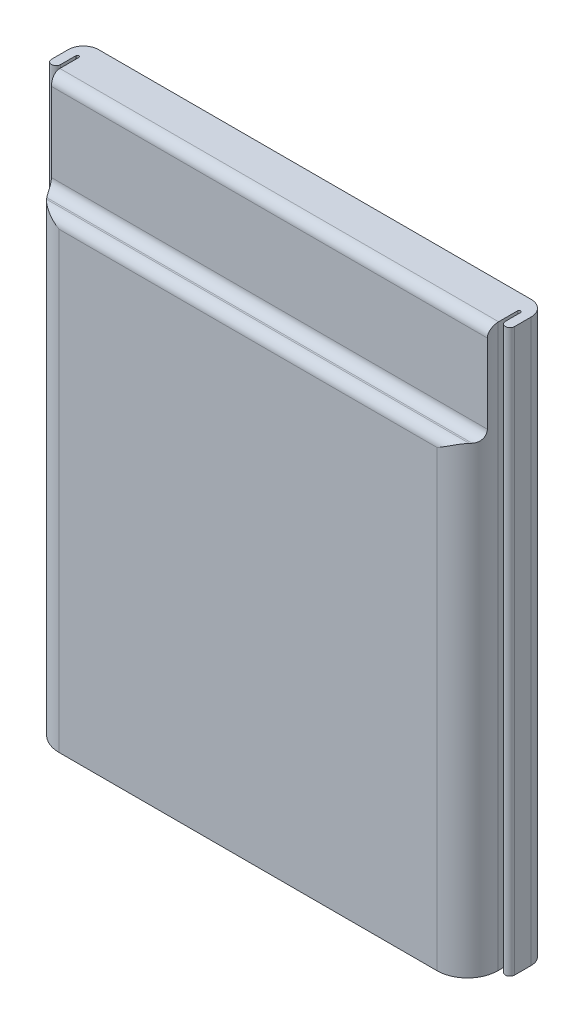
ISO-10303-21;
HEADER;
FILE_DESCRIPTION(('STEP AP214'),'2;1');
FILE_NAME('part.step','',(''),(''),'','','');
FILE_SCHEMA(('AUTOMOTIVE_DESIGN { 1 0 10303 214 1 1 1 1 }'));
ENDSEC;
DATA;
#1=APPLICATION_CONTEXT('core data for automotive mechanical design processes');
#2=APPLICATION_PROTOCOL_DEFINITION('international standard','automotive_design',2000,#1);
#3=PRODUCT_CONTEXT('',#1,'mechanical');
#4=PRODUCT('Part','Part','',(#3));
#5=PRODUCT_RELATED_PRODUCT_CATEGORY('part','',(#4));
#6=PRODUCT_DEFINITION_FORMATION('','',#4);
#7=PRODUCT_DEFINITION_CONTEXT('part definition',#1,'design');
#8=PRODUCT_DEFINITION('design','',#6,#7);
#9=PRODUCT_DEFINITION_SHAPE('','',#8);
#10=(LENGTH_UNIT() NAMED_UNIT(*) SI_UNIT(.MILLI.,.METRE.));
#11=(NAMED_UNIT(*) PLANE_ANGLE_UNIT() SI_UNIT($,.RADIAN.));
#12=(NAMED_UNIT(*) SI_UNIT($,.STERADIAN.) SOLID_ANGLE_UNIT());
#13=UNCERTAINTY_MEASURE_WITH_UNIT(LENGTH_MEASURE(1.E-05),#10,'distance_accuracy_value','');
#14=(GEOMETRIC_REPRESENTATION_CONTEXT(3) GLOBAL_UNCERTAINTY_ASSIGNED_CONTEXT((#13)) GLOBAL_UNIT_ASSIGNED_CONTEXT((#10,
#11,#12)) REPRESENTATION_CONTEXT('',''));
#15=CARTESIAN_POINT('',(0.,0.,0.));
#16=DIRECTION('',(0.,0.,1.));
#17=DIRECTION('',(1.,0.,0.));
#18=AXIS2_PLACEMENT_3D('',#15,#16,#17);
#19=CARTESIAN_POINT('',(-14.45,18.5,2.4));
#20=DIRECTION('',(1.,0.,0.));
#21=DIRECTION('',(0.,0.,-1.));
#22=AXIS2_PLACEMENT_3D('',#19,#20,#21);
#23=PLANE('',#22);
#24=CARTESIAN_POINT('',(-14.45,17.85,2.35));
#25=DIRECTION('',(1.,0.,0.));
#26=DIRECTION('',(0.,0.,-1.));
#27=AXIS2_PLACEMENT_3D('',#24,#25,#26);
#28=CIRCLE('',#27,0.650000000000001);
#29=CARTESIAN_POINT('',(-14.45,18.5,2.35));
#30=VERTEX_POINT('',#29);
#31=CARTESIAN_POINT('',(-14.45,18.4980740698408,2.4));
#32=VERTEX_POINT('',#31);
#33=EDGE_CURVE('E247',#30,#32,#28,.T.);
#34=ORIENTED_EDGE('',*,*,#33,.F.);
#35=DIRECTION('',(0.,0.,1.));
#36=VECTOR('',#35,1.);
#37=CARTESIAN_POINT('',(-14.45,18.5,2.4));
#38=LINE('',#37,#36);
#39=CARTESIAN_POINT('',(-14.45,18.5,1.1));
#40=VERTEX_POINT('',#39);
#41=EDGE_CURVE('E411',#40,#30,#38,.T.);
#42=ORIENTED_EDGE('',*,*,#41,.F.);
#43=DIRECTION('',(0.,-1.,0.));
#44=VECTOR('',#43,1.);
#45=CARTESIAN_POINT('',(-14.45,18.5,1.1));
#46=LINE('',#45,#44);
#47=CARTESIAN_POINT('',(-14.45,-18.5,1.1));
#48=VERTEX_POINT('',#47);
#49=EDGE_CURVE('E239',#40,#48,#46,.T.);
#50=ORIENTED_EDGE('',*,*,#49,.T.);
#51=DIRECTION('',(0.,0.,1.));
#52=VECTOR('',#51,1.);
#53=CARTESIAN_POINT('',(-14.45,-18.5,2.4));
#54=LINE('',#53,#52);
#55=CARTESIAN_POINT('',(-14.45,-18.5,2.4));
#56=VERTEX_POINT('',#55);
#57=EDGE_CURVE('E193',#48,#56,#54,.T.);
#58=ORIENTED_EDGE('',*,*,#57,.T.);
#59=DIRECTION('',(0.,-1.,0.));
#60=VECTOR('',#59,1.);
#61=CARTESIAN_POINT('',(-14.45,18.5,2.4));
#62=LINE('',#61,#60);
#63=EDGE_CURVE('E236',#32,#56,#62,.T.);
#64=ORIENTED_EDGE('',*,*,#63,.F.);
#65=EDGE_LOOP('',(#34,#42,#50,#58,#64));
#66=FACE_BOUND('',#65,.T.);
#67=ADVANCED_FACE('F35',(#66),#23,.F.);
#68=CARTESIAN_POINT('',(-12.45,18.5,2.4));
#69=DIRECTION('',(0.,-1.,0.));
#70=DIRECTION('',(0.,0.,-1.));
#71=AXIS2_PLACEMENT_3D('',#68,#69,#70);
#72=CYLINDRICAL_SURFACE('',#71,2.);
#73=CARTESIAN_POINT('',(-13.9256354563374,12.,3.75));
#74=CARTESIAN_POINT('',(-13.9026747888121,11.9999932469629,3.77510429602965));
#75=CARTESIAN_POINT('',(-13.879092967008,11.9985470125779,3.79958775562649));
#76=CARTESIAN_POINT('',(-13.8309067781463,11.9931451991544,3.84714747151513));
#77=CARTESIAN_POINT('',(-13.8063044500061,11.98919441785,3.87022632604329));
#78=CARTESIAN_POINT('',(-13.7316585836141,11.9742282759658,3.93680407014389));
#79=CARTESIAN_POINT('',(-13.6803126692842,11.9600840157248,3.97814755553334));
#80=CARTESIAN_POINT('',(-13.5508541290508,11.9177087843941,4.07247974823716));
#81=CARTESIAN_POINT('',(-13.4713753583094,11.8859868263596,4.12197198080512));
#82=CARTESIAN_POINT('',(-13.3089684463905,11.8141624891678,4.20851066967203));
#83=CARTESIAN_POINT('',(-13.2260211472614,11.774006663803,4.24547362186481));
#84=CARTESIAN_POINT('',(-13.0299445242252,11.6741623799291,4.31780631918262));
#85=CARTESIAN_POINT('',(-12.9160940623516,11.6124606757062,4.34841050017292));
#86=CARTESIAN_POINT('',(-12.6873647936438,11.4852882861594,4.38924690264115));
#87=CARTESIAN_POINT('',(-12.5724900789546,11.4198294206408,4.39953975746523));
#88=CARTESIAN_POINT('',(-12.4551801140564,11.3529531167111,4.39999495627204));
#89=CARTESIAN_POINT('',(-12.4525900127255,11.3514765316063,4.39999998679931));
#90=CARTESIAN_POINT('',(-12.45,11.35,4.4));
#91=B_SPLINE_CURVE_WITH_KNOTS('',3,(#73,#74,#75,#76,#77,#78,#79,#80,#81,#82,#83,#84,#85,#86,#87,
#88,#89,#90),.UNSPECIFIED.,.F.,.F.,(4,2,2,2,2,2,2,2,4),(0.,0.101961062793665,0.203727395778633,
0.405233373896115,0.70022885501782,0.997153423353587,1.39448612501562,1.79063090440368,
1.79957518905045),.UNSPECIFIED.);
#92=CARTESIAN_POINT('',(-13.9256354563374,12.,3.75));
#93=VERTEX_POINT('',#92);
#94=CARTESIAN_POINT('',(-12.45,11.35,4.4));
#95=VERTEX_POINT('',#94);
#96=EDGE_CURVE('E265',#93,#95,#91,.T.);
#97=ORIENTED_EDGE('',*,*,#96,.F.);
#98=CARTESIAN_POINT('',(-12.45,12.,2.4));
#99=DIRECTION('',(0.,-1.,0.));
#100=DIRECTION('',(0.,0.,-1.));
#101=AXIS2_PLACEMENT_3D('',#98,#99,#100);
#102=CIRCLE('',#101,2.);
#103=CARTESIAN_POINT('',(-14.0112494995996,12.,3.65));
#104=VERTEX_POINT('',#103);
#105=EDGE_CURVE('E279',#104,#93,#102,.F.);
#106=ORIENTED_EDGE('',*,*,#105,.F.);
#107=CARTESIAN_POINT('',(-14.3578784028339,12.65,3.));
#108=CARTESIAN_POINT('',(-14.3578627530609,12.6150901491555,2.99996280426446));
#109=CARTESIAN_POINT('',(-14.3569942029035,12.5801890641818,3.00281011470922));
#110=CARTESIAN_POINT('',(-14.3534345214201,12.511412041176,3.01400247502812));
#111=CARTESIAN_POINT('',(-14.3507453176745,12.4775350584827,3.02234171018239));
#112=CARTESIAN_POINT('',(-14.3434260841778,12.4117185870367,3.04425347546814));
#113=CARTESIAN_POINT('',(-14.3387950310084,12.3797801301262,3.05782876486885));
#114=CARTESIAN_POINT('',(-14.3274009035737,12.3187600161278,3.08967566264036));
#115=CARTESIAN_POINT('',(-14.3206381124273,12.289677980347,3.10794664730996));
#116=CARTESIAN_POINT('',(-14.3047836616288,12.2350843992087,3.14849854485345));
#117=CARTESIAN_POINT('',(-14.2956874069876,12.2095800539942,3.17078734344517));
#118=CARTESIAN_POINT('',(-14.2750598498923,12.162801185568,3.21843088511801));
#119=CARTESIAN_POINT('',(-14.263529431268,12.1415251325186,3.24378451395414));
#120=CARTESIAN_POINT('',(-14.2376805861085,12.1030083732828,3.29727462151482));
#121=CARTESIAN_POINT('',(-14.2232959042517,12.0858906627043,3.32546735128502));
#122=CARTESIAN_POINT('',(-14.1920487355771,12.0564731644133,3.38302736337619));
#123=CARTESIAN_POINT('',(-14.1751812692769,12.0441832454348,3.41239691772208));
#124=CARTESIAN_POINT('',(-14.1356634636242,12.0223012446498,3.4771442195502));
#125=CARTESIAN_POINT('',(-14.1125281575885,12.01371451366,3.51256804911296));
#126=CARTESIAN_POINT('',(-14.0758829538754,12.0053543290935,3.56488663641589));
#127=CARTESIAN_POINT('',(-14.0633629665149,12.0033206217783,3.58216646492549));
#128=CARTESIAN_POINT('',(-14.037735664866,12.0006451397011,3.61636799464567));
#129=CARTESIAN_POINT('',(-14.0246289861214,12.0000018942399,3.63329005548458));
#130=CARTESIAN_POINT('',(-14.0112494995996,12.,3.65));
#131=B_SPLINE_CURVE_WITH_KNOTS('',3,(#107,#108,#109,#110,#111,#112,#113,#114,#115,#116,#117,
#118,#119,#120,#121,#122,#123,#124,#125,#126,#127,#128,#129,#130),.UNSPECIFIED.,.F.,.F.,(4,2,2,
2,2,2,2,2,2,2,2,4),(0.,0.104590308488078,0.209070056884064,0.313604938876844,0.418125943293893,
0.522854368870128,0.627544833408736,0.735032241028295,0.842738239775222,0.971618257924658,
1.03587946054812,1.10007266041649),.UNSPECIFIED.);
#132=CARTESIAN_POINT('',(-14.3578784028339,12.65,3.));
#133=VERTEX_POINT('',#132);
#134=EDGE_CURVE('E272',#133,#104,#131,.T.);
#135=ORIENTED_EDGE('',*,*,#134,.F.);
#136=DIRECTION('',(0.,-1.,0.));
#137=VECTOR('',#136,1.);
#138=CARTESIAN_POINT('',(-14.3578784028339,18.5,3.));
#139=LINE('',#138,#137);
#140=CARTESIAN_POINT('',(-14.3578784028339,17.85,3.));
#141=VERTEX_POINT('',#140);
#142=EDGE_CURVE('E248',#141,#133,#139,.T.);
#143=ORIENTED_EDGE('',*,*,#142,.F.);
#144=CARTESIAN_POINT('',(-14.45,18.4980740698408,2.4));
#145=CARTESIAN_POINT('',(-14.4500324153225,18.4953609823716,2.4356126279228));
#146=CARTESIAN_POINT('',(-14.4490497940261,18.4896491833578,2.47096297856217));
#147=CARTESIAN_POINT('',(-14.4453784390677,18.4725893929244,2.54008983193688));
#148=CARTESIAN_POINT('',(-14.4426942107819,18.4612563022898,2.5738702387059));
#149=CARTESIAN_POINT('',(-14.4359417399539,18.4333027830523,2.63899288992212));
#150=CARTESIAN_POINT('',(-14.4318740458823,18.4166844499362,2.67033609454962));
#151=CARTESIAN_POINT('',(-14.4228443544723,18.3786528930376,2.72983253161998));
#152=CARTESIAN_POINT('',(-14.4178819370472,18.3572374157707,2.75798425545624));
#153=CARTESIAN_POINT('',(-14.407469911843,18.3094862586317,2.8111799394193));
#154=CARTESIAN_POINT('',(-14.402010346082,18.2830258506174,2.83611003088603));
#155=CARTESIAN_POINT('',(-14.3913748475305,18.2262800269991,2.88125126009492));
#156=CARTESIAN_POINT('',(-14.3861990070265,18.1959933773085,2.9014608693108));
#157=CARTESIAN_POINT('',(-14.3766754339758,18.1318014025509,2.93690380674877));
#158=CARTESIAN_POINT('',(-14.3723438667212,18.0978418024241,2.95204336366167));
#159=CARTESIAN_POINT('',(-14.3652040833208,18.0277162770809,2.97632967918542));
#160=CARTESIAN_POINT('',(-14.3623936511833,17.9915536472154,2.9854851594685));
#161=CARTESIAN_POINT('',(-14.3596577685976,17.9375398039883,2.99431863324235));
#162=CARTESIAN_POINT('',(-14.3589925247615,17.9200952829154,2.9964483992284));
#163=CARTESIAN_POINT('',(-14.3581024576008,17.8851035443164,2.99928815124529));
#164=CARTESIAN_POINT('',(-14.3578770446476,17.8675564959517,3.0000000380833));
#165=CARTESIAN_POINT('',(-14.3578784028339,17.85,3.));
#166=B_SPLINE_CURVE_WITH_KNOTS('',3,(#144,#145,#146,#147,#148,#149,#150,#151,#152,#153,#154,
#155,#156,#157,#158,#159,#160,#161,#162,#163,#164,#165),.UNSPECIFIED.,.F.,.F.,(4,2,2,2,2,2,2,2,
2,2,4),(0.,0.10696296218488,0.213643892726844,0.320282579154899,0.426971465127316,
0.536755857074836,0.646575748872066,0.758327092758692,0.869915195930895,0.922620970415679,
0.975256039912544),.UNSPECIFIED.);
#167=EDGE_CURVE('E244',#32,#141,#166,.T.);
#168=ORIENTED_EDGE('',*,*,#167,.F.);
#169=ORIENTED_EDGE('',*,*,#63,.T.);
#170=CARTESIAN_POINT('',(-12.45,-18.5,2.4));
#171=DIRECTION('',(0.,1.,0.));
#172=DIRECTION('',(0.,0.,1.));
#173=AXIS2_PLACEMENT_3D('',#170,#171,#172);
#174=CIRCLE('',#173,2.);
#175=CARTESIAN_POINT('',(-12.45,-18.5,4.4));
#176=VERTEX_POINT('',#175);
#177=EDGE_CURVE('E196',#56,#176,#174,.T.);
#178=ORIENTED_EDGE('',*,*,#177,.T.);
#179=DIRECTION('',(0.,-1.,0.));
#180=VECTOR('',#179,1.);
#181=CARTESIAN_POINT('',(-12.45,18.5,4.4));
#182=LINE('',#181,#180);
#183=EDGE_CURVE('E234',#95,#176,#182,.T.);
#184=ORIENTED_EDGE('',*,*,#183,.F.);
#185=EDGE_LOOP('',(#97,#106,#135,#143,#168,#169,#178,#184));
#186=FACE_BOUND('',#185,.T.);
#187=ADVANCED_FACE('F357',(#186),#72,.T.);
#188=CARTESIAN_POINT('',(12.45,18.5,2.4));
#189=DIRECTION('',(0.,-1.,0.));
#190=DIRECTION('',(0.,0.,-1.));
#191=AXIS2_PLACEMENT_3D('',#188,#189,#190);
#192=CYLINDRICAL_SURFACE('',#191,2.);
#193=CARTESIAN_POINT('',(13.9256354563374,12.,3.75));
#194=CARTESIAN_POINT('',(13.9026747888121,11.9999932469629,3.77510429602965));
#195=CARTESIAN_POINT('',(13.879092967008,11.9985470125779,3.79958775562648));
#196=CARTESIAN_POINT('',(13.8309067781463,11.9931451991544,3.84714747151512));
#197=CARTESIAN_POINT('',(13.8063044500062,11.98919441785,3.87022632604328));
#198=CARTESIAN_POINT('',(13.7316585836141,11.9742282759658,3.93680407014388));
#199=CARTESIAN_POINT('',(13.6803126692842,11.9600840157248,3.97814755553334));
#200=CARTESIAN_POINT('',(13.5508541290508,11.9177087843941,4.07247974823717));
#201=CARTESIAN_POINT('',(13.4713753583094,11.8859868263596,4.12197198080512));
#202=CARTESIAN_POINT('',(13.3089684463905,11.8141624891677,4.20851066967203));
#203=CARTESIAN_POINT('',(13.2260211472614,11.7740066638029,4.24547362186482));
#204=CARTESIAN_POINT('',(13.0299445242252,11.6741623799292,4.31780631918262));
#205=CARTESIAN_POINT('',(12.9160940623515,11.6124606757064,4.34841050017292));
#206=CARTESIAN_POINT('',(12.6873647936439,11.4852882861592,4.38924690264116));
#207=CARTESIAN_POINT('',(12.572490078955,11.4198294206401,4.39953975746524));
#208=CARTESIAN_POINT('',(12.4551801140564,11.352953116711,4.39999495627204));
#209=CARTESIAN_POINT('',(12.4525900127255,11.3514765316063,4.39999998679931));
#210=CARTESIAN_POINT('',(12.45,11.35,4.4));
#211=B_SPLINE_CURVE_WITH_KNOTS('',3,(#193,#194,#195,#196,#197,#198,#199,#200,#201,#202,#203,
#204,#205,#206,#207,#208,#209,#210),.UNSPECIFIED.,.F.,.F.,(4,2,2,2,2,2,2,2,4),(0.,
0.101961062793656,0.203727395778614,0.405233373896118,0.700228855017839,0.997153423353592,
1.39448612501562,1.79063090440368,1.79957518905045),.UNSPECIFIED.);
#212=CARTESIAN_POINT('',(13.9256354563374,12.,3.75));
#213=VERTEX_POINT('',#212);
#214=CARTESIAN_POINT('',(12.45,11.35,4.4));
#215=VERTEX_POINT('',#214);
#216=EDGE_CURVE('E301',#213,#215,#211,.T.);
#217=ORIENTED_EDGE('',*,*,#216,.T.);
#218=DIRECTION('',(0.,-1.,0.));
#219=VECTOR('',#218,1.);
#220=CARTESIAN_POINT('',(12.45,18.5,4.4));
#221=LINE('',#220,#219);
#222=CARTESIAN_POINT('',(12.45,-18.5,4.4));
#223=VERTEX_POINT('',#222);
#224=EDGE_CURVE('E232',#215,#223,#221,.T.);
#225=ORIENTED_EDGE('',*,*,#224,.T.);
#226=CARTESIAN_POINT('',(12.45,-18.5,2.4));
#227=DIRECTION('',(0.,1.,0.));
#228=DIRECTION('',(0.,0.,-1.));
#229=AXIS2_PLACEMENT_3D('',#226,#227,#228);
#230=CIRCLE('',#229,2.);
#231=CARTESIAN_POINT('',(14.45,-18.5,2.4));
#232=VERTEX_POINT('',#231);
#233=EDGE_CURVE('E202',#223,#232,#230,.T.);
#234=ORIENTED_EDGE('',*,*,#233,.T.);
#235=DIRECTION('',(0.,-1.,0.));
#236=VECTOR('',#235,1.);
#237=CARTESIAN_POINT('',(14.45,18.5,2.4));
#238=LINE('',#237,#236);
#239=CARTESIAN_POINT('',(14.45,18.4980740698408,2.4));
#240=VERTEX_POINT('',#239);
#241=EDGE_CURVE('E230',#240,#232,#238,.T.);
#242=ORIENTED_EDGE('',*,*,#241,.F.);
#243=CARTESIAN_POINT('',(14.45,18.4980740698408,2.4));
#244=CARTESIAN_POINT('',(14.4500324153225,18.4953609823716,2.4356126279228));
#245=CARTESIAN_POINT('',(14.4490497940261,18.4896491833578,2.47096297856217));
#246=CARTESIAN_POINT('',(14.4453784390677,18.4725893929244,2.54008983193688));
#247=CARTESIAN_POINT('',(14.4426942107819,18.4612563022898,2.5738702387059));
#248=CARTESIAN_POINT('',(14.4359417399539,18.4333027830523,2.63899288992212));
#249=CARTESIAN_POINT('',(14.4318740458823,18.4166844499362,2.67033609454962));
#250=CARTESIAN_POINT('',(14.4228443544723,18.3786528930376,2.72983253161998));
#251=CARTESIAN_POINT('',(14.4178819370472,18.3572374157707,2.75798425545624));
#252=CARTESIAN_POINT('',(14.407469911843,18.3094862586317,2.8111799394193));
#253=CARTESIAN_POINT('',(14.402010346082,18.2830258506174,2.83611003088604));
#254=CARTESIAN_POINT('',(14.3913748475305,18.2262800269991,2.88125126009492));
#255=CARTESIAN_POINT('',(14.3861990070265,18.1959933773085,2.9014608693108));
#256=CARTESIAN_POINT('',(14.3766754339758,18.1318014025509,2.93690380674877));
#257=CARTESIAN_POINT('',(14.3723438667212,18.0978418024241,2.95204336366167));
#258=CARTESIAN_POINT('',(14.3652040833208,18.0277162770809,2.97632967918542));
#259=CARTESIAN_POINT('',(14.3623936511833,17.9915536472154,2.9854851594685));
#260=CARTESIAN_POINT('',(14.3596577685976,17.9375398039883,2.99431863324235));
#261=CARTESIAN_POINT('',(14.3589925247615,17.9200952829154,2.9964483992284));
#262=CARTESIAN_POINT('',(14.3581024576008,17.8851035443164,2.99928815124529));
#263=CARTESIAN_POINT('',(14.3578770446476,17.8675564959517,3.0000000380833));
#264=CARTESIAN_POINT('',(14.3578784028339,17.85,3.));
#265=B_SPLINE_CURVE_WITH_KNOTS('',3,(#243,#244,#245,#246,#247,#248,#249,#250,#251,#252,#253,
#254,#255,#256,#257,#258,#259,#260,#261,#262,#263,#264),.UNSPECIFIED.,.F.,.F.,(4,2,2,2,2,2,2,2,
2,2,4),(0.,0.106962962184881,0.213643892726846,0.320282579154904,0.426971465127317,
0.536755857074841,0.64657574887207,0.758327092758695,0.869915195930898,0.922620970415679,
0.975256039912544),.UNSPECIFIED.);
#266=CARTESIAN_POINT('',(14.3578784028339,17.85,3.));
#267=VERTEX_POINT('',#266);
#268=EDGE_CURVE('E308',#240,#267,#265,.T.);
#269=ORIENTED_EDGE('',*,*,#268,.T.);
#270=DIRECTION('',(0.,-1.,0.));
#271=VECTOR('',#270,1.);
#272=CARTESIAN_POINT('',(14.3578784028339,18.5,3.));
#273=LINE('',#272,#271);
#274=CARTESIAN_POINT('',(14.3578784028339,12.65,3.));
#275=VERTEX_POINT('',#274);
#276=EDGE_CURVE('E185',#267,#275,#273,.T.);
#277=ORIENTED_EDGE('',*,*,#276,.T.);
#278=CARTESIAN_POINT('',(14.3578784028339,12.65,3.));
#279=CARTESIAN_POINT('',(14.3578627530609,12.6150901491555,2.99996280426446));
#280=CARTESIAN_POINT('',(14.3569942029035,12.5801890641818,3.00281011470922));
#281=CARTESIAN_POINT('',(14.3534345214201,12.511412041176,3.01400247502812));
#282=CARTESIAN_POINT('',(14.3507453176745,12.4775350584827,3.02234171018239));
#283=CARTESIAN_POINT('',(14.3434260841778,12.4117185870367,3.04425347546814));
#284=CARTESIAN_POINT('',(14.3387950310084,12.3797801301262,3.05782876486885));
#285=CARTESIAN_POINT('',(14.3274009035737,12.3187600161278,3.08967566264037));
#286=CARTESIAN_POINT('',(14.3206381124273,12.289677980347,3.10794664730996));
#287=CARTESIAN_POINT('',(14.3047836616288,12.2350843992087,3.14849854485345));
#288=CARTESIAN_POINT('',(14.2956874069876,12.2095800539942,3.17078734344517));
#289=CARTESIAN_POINT('',(14.2750598498923,12.162801185568,3.21843088511801));
#290=CARTESIAN_POINT('',(14.263529431268,12.1415251325186,3.24378451395414));
#291=CARTESIAN_POINT('',(14.2376805861085,12.1030083732828,3.29727462151482));
#292=CARTESIAN_POINT('',(14.2232959042517,12.0858906627043,3.32546735128502));
#293=CARTESIAN_POINT('',(14.1920487355771,12.0564731644133,3.38302736337619));
#294=CARTESIAN_POINT('',(14.1751812692769,12.0441832454348,3.41239691772208));
#295=CARTESIAN_POINT('',(14.1356634636242,12.0223012446498,3.4771442195502));
#296=CARTESIAN_POINT('',(14.1125281575885,12.01371451366,3.51256804911295));
#297=CARTESIAN_POINT('',(14.0758829538754,12.0053543290935,3.56488663641589));
#298=CARTESIAN_POINT('',(14.0633629665149,12.0033206217783,3.58216646492549));
#299=CARTESIAN_POINT('',(14.037735664866,12.0006451397011,3.61636799464567));
#300=CARTESIAN_POINT('',(14.0246289861214,12.0000018942399,3.63329005548458));
#301=CARTESIAN_POINT('',(14.0112494995996,12.,3.65));
#302=B_SPLINE_CURVE_WITH_KNOTS('',3,(#278,#279,#280,#281,#282,#283,#284,#285,#286,#287,#288,
#289,#290,#291,#292,#293,#294,#295,#296,#297,#298,#299,#300,#301),.UNSPECIFIED.,.F.,.F.,(4,2,2,
2,2,2,2,2,2,2,2,4),(0.,0.104590308488078,0.209070056884064,0.313604938876846,0.418125943293893,
0.522854368870128,0.627544833408735,0.735032241028295,0.842738239775221,0.971618257924655,
1.03587946054812,1.10007266041649),.UNSPECIFIED.);
#303=CARTESIAN_POINT('',(14.0112494995996,12.,3.65));
#304=VERTEX_POINT('',#303);
#305=EDGE_CURVE('E282',#275,#304,#302,.T.);
#306=ORIENTED_EDGE('',*,*,#305,.T.);
#307=CARTESIAN_POINT('',(12.45,12.,2.4));
#308=DIRECTION('',(0.,1.,0.));
#309=DIRECTION('',(0.,0.,1.));
#310=AXIS2_PLACEMENT_3D('',#307,#308,#309);
#311=CIRCLE('',#310,2.);
#312=EDGE_CURVE('E290',#304,#213,#311,.F.);
#313=ORIENTED_EDGE('',*,*,#312,.T.);
#314=EDGE_LOOP('',(#217,#225,#234,#242,#269,#277,#306,#313));
#315=FACE_BOUND('',#314,.T.);
#316=ADVANCED_FACE('F353',(#315),#192,.T.);
#317=CARTESIAN_POINT('',(14.45,18.5,1.1));
#318=DIRECTION('',(-1.,0.,0.));
#319=DIRECTION('',(0.,0.,1.));
#320=AXIS2_PLACEMENT_3D('',#317,#318,#319);
#321=PLANE('',#320);
#322=CARTESIAN_POINT('',(14.45,17.85,2.35));
#323=DIRECTION('',(-1.,0.,0.));
#324=DIRECTION('',(0.,0.,1.));
#325=AXIS2_PLACEMENT_3D('',#322,#323,#324);
#326=CIRCLE('',#325,0.650000000000001);
#327=CARTESIAN_POINT('',(14.45,18.5,2.35));
#328=VERTEX_POINT('',#327);
#329=EDGE_CURVE('E52',#328,#240,#326,.F.);
#330=ORIENTED_EDGE('',*,*,#329,.T.);
#331=ORIENTED_EDGE('',*,*,#241,.T.);
#332=DIRECTION('',(0.,0.,-1.));
#333=VECTOR('',#332,1.);
#334=CARTESIAN_POINT('',(14.45,-18.5,1.1));
#335=LINE('',#334,#333);
#336=CARTESIAN_POINT('',(14.45,-18.5,1.1));
#337=VERTEX_POINT('',#336);
#338=EDGE_CURVE('E205',#232,#337,#335,.T.);
#339=ORIENTED_EDGE('',*,*,#338,.T.);
#340=DIRECTION('',(0.,-1.,0.));
#341=VECTOR('',#340,1.);
#342=CARTESIAN_POINT('',(14.45,18.5,1.1));
#343=LINE('',#342,#341);
#344=CARTESIAN_POINT('',(14.45,18.5,1.1));
#345=VERTEX_POINT('',#344);
#346=EDGE_CURVE('E227',#345,#337,#343,.T.);
#347=ORIENTED_EDGE('',*,*,#346,.F.);
#348=DIRECTION('',(0.,0.,-1.));
#349=VECTOR('',#348,1.);
#350=CARTESIAN_POINT('',(14.45,18.5,1.1));
#351=LINE('',#350,#349);
#352=EDGE_CURVE('E473',#328,#345,#351,.T.);
#353=ORIENTED_EDGE('',*,*,#352,.F.);
#354=EDGE_LOOP('',(#330,#331,#339,#347,#353));
#355=FACE_BOUND('',#354,.T.);
#356=ADVANCED_FACE('F350',(#355),#321,.F.);
#357=CARTESIAN_POINT('',(-14.25,18.5,0.999999999999998));
#358=DIRECTION('',(0.,-1.,0.));
#359=DIRECTION('',(0.,0.,-1.));
#360=AXIS2_PLACEMENT_3D('',#357,#358,#359);
#361=CYLINDRICAL_SURFACE('',#360,1.);
#362=CARTESIAN_POINT('',(-14.25,-18.5,0.999999999999998));
#363=DIRECTION('',(0.,1.,0.));
#364=DIRECTION('',(0.,0.,1.));
#365=AXIS2_PLACEMENT_3D('',#362,#363,#364);
#366=CIRCLE('',#365,1.);
#367=CARTESIAN_POINT('',(-14.25,-18.5,0.));
#368=VERTEX_POINT('',#367);
#369=CARTESIAN_POINT('',(-15.25,-18.5,1.));
#370=VERTEX_POINT('',#369);
#371=EDGE_CURVE('E181',#368,#370,#366,.T.);
#372=ORIENTED_EDGE('',*,*,#371,.T.);
#373=DIRECTION('',(0.,-1.,0.));
#374=VECTOR('',#373,1.);
#375=CARTESIAN_POINT('',(-15.25,18.5,1.));
#376=LINE('',#375,#374);
#377=CARTESIAN_POINT('',(-15.25,18.5,1.));
#378=VERTEX_POINT('',#377);
#379=EDGE_CURVE('E11',#378,#370,#376,.T.);
#380=ORIENTED_EDGE('',*,*,#379,.F.);
#381=CARTESIAN_POINT('',(-14.25,18.5,0.999999999999998));
#382=DIRECTION('',(0.,1.,0.));
#383=DIRECTION('',(0.,0.,1.));
#384=AXIS2_PLACEMENT_3D('',#381,#382,#383);
#385=CIRCLE('',#384,1.);
#386=CARTESIAN_POINT('',(-14.25,18.5,0.));
#387=VERTEX_POINT('',#386);
#388=EDGE_CURVE('E217',#387,#378,#385,.T.);
#389=ORIENTED_EDGE('',*,*,#388,.F.);
#390=DIRECTION('',(0.,-1.,0.));
#391=VECTOR('',#390,1.);
#392=CARTESIAN_POINT('',(-14.25,18.5,0.));
#393=LINE('',#392,#391);
#394=EDGE_CURVE('E177',#387,#368,#393,.T.);
#395=ORIENTED_EDGE('',*,*,#394,.T.);
#396=EDGE_LOOP('',(#372,#380,#389,#395));
#397=FACE_BOUND('',#396,.T.);
#398=ADVANCED_FACE('F37',(#397),#361,.T.);
#399=CARTESIAN_POINT('',(-15.25,18.5,1.));
#400=DIRECTION('',(1.,0.,0.));
#401=DIRECTION('',(0.,0.,-1.));
#402=AXIS2_PLACEMENT_3D('',#399,#400,#401);
#403=PLANE('',#402);
#404=DIRECTION('',(0.,0.,1.));
#405=VECTOR('',#404,1.);
#406=CARTESIAN_POINT('',(-15.25,-18.5,1.));
#407=LINE('',#406,#405);
#408=CARTESIAN_POINT('',(-15.25,-18.5,2.1));
#409=VERTEX_POINT('',#408);
#410=EDGE_CURVE('E184',#370,#409,#407,.T.);
#411=ORIENTED_EDGE('',*,*,#410,.T.);
#412=DIRECTION('',(0.,-1.,0.));
#413=VECTOR('',#412,1.);
#414=CARTESIAN_POINT('',(-15.25,18.5,2.1));
#415=LINE('',#414,#413);
#416=CARTESIAN_POINT('',(-15.25,18.5,2.1));
#417=VERTEX_POINT('',#416);
#418=EDGE_CURVE('E44',#417,#409,#415,.T.);
#419=ORIENTED_EDGE('',*,*,#418,.F.);
#420=DIRECTION('',(0.,0.,1.));
#421=VECTOR('',#420,1.);
#422=CARTESIAN_POINT('',(-15.25,18.5,1.));
#423=LINE('',#422,#421);
#424=EDGE_CURVE('E126',#378,#417,#423,.T.);
#425=ORIENTED_EDGE('',*,*,#424,.F.);
#426=ORIENTED_EDGE('',*,*,#379,.T.);
#427=EDGE_LOOP('',(#411,#419,#425,#426));
#428=FACE_BOUND('',#427,.T.);
#429=ADVANCED_FACE('F378',(#428),#403,.F.);
#430=CARTESIAN_POINT('',(-14.95,18.5,2.1));
#431=DIRECTION('',(0.,-1.,0.));
#432=DIRECTION('',(0.,0.,-1.));
#433=AXIS2_PLACEMENT_3D('',#430,#431,#432);
#434=CYLINDRICAL_SURFACE('',#433,0.300000000000002);
#435=CARTESIAN_POINT('',(-14.95,-18.5,2.1));
#436=DIRECTION('',(0.,1.,0.));
#437=DIRECTION('',(0.,0.,1.));
#438=AXIS2_PLACEMENT_3D('',#435,#436,#437);
#439=CIRCLE('',#438,0.300000000000002);
#440=CARTESIAN_POINT('',(-14.65,-18.5,2.1));
#441=VERTEX_POINT('',#440);
#442=EDGE_CURVE('E187',#409,#441,#439,.T.);
#443=ORIENTED_EDGE('',*,*,#442,.T.);
#444=DIRECTION('',(0.,-1.,0.));
#445=VECTOR('',#444,1.);
#446=CARTESIAN_POINT('',(-14.65,18.5,2.1));
#447=LINE('',#446,#445);
#448=CARTESIAN_POINT('',(-14.65,18.5,2.1));
#449=VERTEX_POINT('',#448);
#450=EDGE_CURVE('E393',#449,#441,#447,.T.);
#451=ORIENTED_EDGE('',*,*,#450,.F.);
#452=CARTESIAN_POINT('',(-14.95,18.5,2.1));
#453=DIRECTION('',(0.,1.,0.));
#454=DIRECTION('',(0.,0.,1.));
#455=AXIS2_PLACEMENT_3D('',#452,#453,#454);
#456=CIRCLE('',#455,0.300000000000002);
#457=EDGE_CURVE('E392',#417,#449,#456,.T.);
#458=ORIENTED_EDGE('',*,*,#457,.F.);
#459=ORIENTED_EDGE('',*,*,#418,.T.);
#460=EDGE_LOOP('',(#443,#451,#458,#459));
#461=FACE_BOUND('',#460,.T.);
#462=ADVANCED_FACE('F375',(#461),#434,.T.);
#463=CARTESIAN_POINT('',(-14.65,18.5,2.1));
#464=DIRECTION('',(-1.,0.,0.));
#465=DIRECTION('',(0.,0.,1.));
#466=AXIS2_PLACEMENT_3D('',#463,#464,#465);
#467=PLANE('',#466);
#468=DIRECTION('',(0.,0.,-1.));
#469=VECTOR('',#468,1.);
#470=CARTESIAN_POINT('',(-14.65,-18.5,2.1));
#471=LINE('',#470,#469);
#472=CARTESIAN_POINT('',(-14.65,-18.5,1.1));
#473=VERTEX_POINT('',#472);
#474=EDGE_CURVE('E189',#441,#473,#471,.T.);
#475=ORIENTED_EDGE('',*,*,#474,.T.);
#476=DIRECTION('',(0.,-1.,0.));
#477=VECTOR('',#476,1.);
#478=CARTESIAN_POINT('',(-14.65,18.5,1.1));
#479=LINE('',#478,#477);
#480=CARTESIAN_POINT('',(-14.65,18.5,1.1));
#481=VERTEX_POINT('',#480);
#482=EDGE_CURVE('E400',#481,#473,#479,.T.);
#483=ORIENTED_EDGE('',*,*,#482,.F.);
#484=DIRECTION('',(0.,0.,-1.));
#485=VECTOR('',#484,1.);
#486=CARTESIAN_POINT('',(-14.65,18.5,2.1));
#487=LINE('',#486,#485);
#488=EDGE_CURVE('E469',#449,#481,#487,.T.);
#489=ORIENTED_EDGE('',*,*,#488,.F.);
#490=ORIENTED_EDGE('',*,*,#450,.T.);
#491=EDGE_LOOP('',(#475,#483,#489,#490));
#492=FACE_BOUND('',#491,.T.);
#493=ADVANCED_FACE('F371',(#492),#467,.F.);
#494=CARTESIAN_POINT('',(-14.55,18.5,1.1));
#495=DIRECTION('',(0.,-1.,0.));
#496=DIRECTION('',(0.,0.,-1.));
#497=AXIS2_PLACEMENT_3D('',#494,#495,#496);
#498=CYLINDRICAL_SURFACE('',#497,0.100000000000001);
#499=CARTESIAN_POINT('',(-14.55,-18.5,1.1));
#500=DIRECTION('',(0.,-1.,0.));
#501=DIRECTION('',(0.,0.,1.));
#502=AXIS2_PLACEMENT_3D('',#499,#500,#501);
#503=CIRCLE('',#502,0.100000000000001);
#504=EDGE_CURVE('E191',#473,#48,#503,.T.);
#505=ORIENTED_EDGE('',*,*,#504,.T.);
#506=ORIENTED_EDGE('',*,*,#49,.F.);
#507=CARTESIAN_POINT('',(-14.55,18.5,1.1));
#508=DIRECTION('',(0.,-1.,0.));
#509=DIRECTION('',(0.,0.,1.));
#510=AXIS2_PLACEMENT_3D('',#507,#508,#509);
#511=CIRCLE('',#510,0.100000000000001);
#512=EDGE_CURVE('E404',#481,#40,#511,.T.);
#513=ORIENTED_EDGE('',*,*,#512,.F.);
#514=ORIENTED_EDGE('',*,*,#482,.T.);
#515=EDGE_LOOP('',(#505,#506,#513,#514));
#516=FACE_BOUND('',#515,.T.);
#517=ADVANCED_FACE('F361',(#516),#498,.F.);
#518=CARTESIAN_POINT('',(-12.45,18.5,4.4));
#519=DIRECTION('',(0.,0.,-1.));
#520=DIRECTION('',(-1.,0.,0.));
#521=AXIS2_PLACEMENT_3D('',#518,#519,#520);
#522=PLANE('',#521);
#523=ORIENTED_EDGE('',*,*,#224,.F.);
#524=DIRECTION('',(-1.,0.,0.));
#525=VECTOR('',#524,1.);
#526=CARTESIAN_POINT('',(15.251,11.35,4.4));
#527=LINE('',#526,#525);
#528=EDGE_CURVE('E462',#215,#95,#527,.T.);
#529=ORIENTED_EDGE('',*,*,#528,.T.);
#530=ORIENTED_EDGE('',*,*,#183,.T.);
#531=DIRECTION('',(1.,0.,0.));
#532=VECTOR('',#531,1.);
#533=CARTESIAN_POINT('',(-12.45,-18.5,4.4));
#534=LINE('',#533,#532);
#535=EDGE_CURVE('E199',#176,#223,#534,.T.);
#536=ORIENTED_EDGE('',*,*,#535,.T.);
#537=EDGE_LOOP('',(#523,#529,#530,#536));
#538=FACE_BOUND('',#537,.T.);
#539=ADVANCED_FACE('F348',(#538),#522,.F.);
#540=CARTESIAN_POINT('',(14.55,18.5,1.1));
#541=DIRECTION('',(0.,-1.,0.));
#542=DIRECTION('',(0.,0.,-1.));
#543=AXIS2_PLACEMENT_3D('',#540,#541,#542);
#544=CYLINDRICAL_SURFACE('',#543,0.0999999999999977);
#545=CARTESIAN_POINT('',(14.55,-18.5,1.1));
#546=DIRECTION('',(0.,-1.,0.));
#547=DIRECTION('',(0.,0.,-1.));
#548=AXIS2_PLACEMENT_3D('',#545,#546,#547);
#549=CIRCLE('',#548,0.0999999999999977);
#550=CARTESIAN_POINT('',(14.65,-18.5,1.1));
#551=VERTEX_POINT('',#550);
#552=EDGE_CURVE('E207',#337,#551,#549,.T.);
#553=ORIENTED_EDGE('',*,*,#552,.T.);
#554=DIRECTION('',(0.,-1.,0.));
#555=VECTOR('',#554,1.);
#556=CARTESIAN_POINT('',(14.65,18.5,1.1));
#557=LINE('',#556,#555);
#558=CARTESIAN_POINT('',(14.65,18.5,1.1));
#559=VERTEX_POINT('',#558);
#560=EDGE_CURVE('E224',#559,#551,#557,.T.);
#561=ORIENTED_EDGE('',*,*,#560,.F.);
#562=CARTESIAN_POINT('',(14.55,18.5,1.1));
#563=DIRECTION('',(0.,-1.,0.));
#564=DIRECTION('',(0.,0.,-1.));
#565=AXIS2_PLACEMENT_3D('',#562,#563,#564);
#566=CIRCLE('',#565,0.0999999999999977);
#567=EDGE_CURVE('E475',#345,#559,#566,.T.);
#568=ORIENTED_EDGE('',*,*,#567,.F.);
#569=ORIENTED_EDGE('',*,*,#346,.T.);
#570=EDGE_LOOP('',(#553,#561,#568,#569));
#571=FACE_BOUND('',#570,.T.);
#572=ADVANCED_FACE('F344',(#571),#544,.F.);
#573=CARTESIAN_POINT('',(14.65,18.5,2.10000000000001));
#574=DIRECTION('',(1.,0.,0.));
#575=DIRECTION('',(0.,0.,-1.));
#576=AXIS2_PLACEMENT_3D('',#573,#574,#575);
#577=PLANE('',#576);
#578=DIRECTION('',(0.,0.,1.));
#579=VECTOR('',#578,1.);
#580=CARTESIAN_POINT('',(14.65,-18.5,2.10000000000001));
#581=LINE('',#580,#579);
#582=CARTESIAN_POINT('',(14.65,-18.5,2.10000000000001));
#583=VERTEX_POINT('',#582);
#584=EDGE_CURVE('E209',#551,#583,#581,.T.);
#585=ORIENTED_EDGE('',*,*,#584,.T.);
#586=DIRECTION('',(0.,-1.,0.));
#587=VECTOR('',#586,1.);
#588=CARTESIAN_POINT('',(14.65,18.5,2.10000000000001));
#589=LINE('',#588,#587);
#590=CARTESIAN_POINT('',(14.65,18.5,2.10000000000001));
#591=VERTEX_POINT('',#590);
#592=EDGE_CURVE('E221',#591,#583,#589,.T.);
#593=ORIENTED_EDGE('',*,*,#592,.F.);
#594=DIRECTION('',(0.,0.,1.));
#595=VECTOR('',#594,1.);
#596=CARTESIAN_POINT('',(14.65,18.5,2.10000000000001));
#597=LINE('',#596,#595);
#598=EDGE_CURVE('E477',#559,#591,#597,.T.);
#599=ORIENTED_EDGE('',*,*,#598,.F.);
#600=ORIENTED_EDGE('',*,*,#560,.T.);
#601=EDGE_LOOP('',(#585,#593,#599,#600));
#602=FACE_BOUND('',#601,.T.);
#603=ADVANCED_FACE('F340',(#602),#577,.F.);
#604=CARTESIAN_POINT('',(14.95,18.5,2.10000000000001));
#605=DIRECTION('',(0.,-1.,0.));
#606=DIRECTION('',(0.,0.,-1.));
#607=AXIS2_PLACEMENT_3D('',#604,#605,#606);
#608=CYLINDRICAL_SURFACE('',#607,0.300000000000005);
#609=CARTESIAN_POINT('',(14.95,-18.5,2.10000000000001));
#610=DIRECTION('',(0.,1.,0.));
#611=DIRECTION('',(0.,0.,-1.));
#612=AXIS2_PLACEMENT_3D('',#609,#610,#611);
#613=CIRCLE('',#612,0.300000000000005);
#614=CARTESIAN_POINT('',(15.25,-18.5,2.10000000000001));
#615=VERTEX_POINT('',#614);
#616=EDGE_CURVE('E211',#583,#615,#613,.T.);
#617=ORIENTED_EDGE('',*,*,#616,.T.);
#618=DIRECTION('',(0.,-1.,0.));
#619=VECTOR('',#618,1.);
#620=CARTESIAN_POINT('',(15.25,18.5,2.10000000000001));
#621=LINE('',#620,#619);
#622=CARTESIAN_POINT('',(15.25,18.5,2.10000000000001));
#623=VERTEX_POINT('',#622);
#624=EDGE_CURVE('E172',#623,#615,#621,.T.);
#625=ORIENTED_EDGE('',*,*,#624,.F.);
#626=CARTESIAN_POINT('',(14.95,18.5,2.10000000000001));
#627=DIRECTION('',(0.,1.,0.));
#628=DIRECTION('',(0.,0.,-1.));
#629=AXIS2_PLACEMENT_3D('',#626,#627,#628);
#630=CIRCLE('',#629,0.300000000000005);
#631=EDGE_CURVE('E160',#591,#623,#630,.T.);
#632=ORIENTED_EDGE('',*,*,#631,.F.);
#633=ORIENTED_EDGE('',*,*,#592,.T.);
#634=EDGE_LOOP('',(#617,#625,#632,#633));
#635=FACE_BOUND('',#634,.T.);
#636=ADVANCED_FACE('F337',(#635),#608,.T.);
#637=CARTESIAN_POINT('',(15.25,18.5,1.));
#638=DIRECTION('',(-1.,0.,0.));
#639=DIRECTION('',(0.,0.,1.));
#640=AXIS2_PLACEMENT_3D('',#637,#638,#639);
#641=PLANE('',#640);
#642=DIRECTION('',(0.,0.,-1.));
#643=VECTOR('',#642,1.);
#644=CARTESIAN_POINT('',(15.25,-18.5,1.));
#645=LINE('',#644,#643);
#646=CARTESIAN_POINT('',(15.25,-18.5,1.));
#647=VERTEX_POINT('',#646);
#648=EDGE_CURVE('E169',#615,#647,#645,.T.);
#649=ORIENTED_EDGE('',*,*,#648,.T.);
#650=DIRECTION('',(0.,-1.,0.));
#651=VECTOR('',#650,1.);
#652=CARTESIAN_POINT('',(15.25,18.5,1.));
#653=LINE('',#652,#651);
#654=CARTESIAN_POINT('',(15.25,18.5,1.));
#655=VERTEX_POINT('',#654);
#656=EDGE_CURVE('E166',#655,#647,#653,.T.);
#657=ORIENTED_EDGE('',*,*,#656,.F.);
#658=DIRECTION('',(0.,0.,-1.));
#659=VECTOR('',#658,1.);
#660=CARTESIAN_POINT('',(15.25,18.5,1.));
#661=LINE('',#660,#659);
#662=EDGE_CURVE('E153',#623,#655,#661,.T.);
#663=ORIENTED_EDGE('',*,*,#662,.F.);
#664=ORIENTED_EDGE('',*,*,#624,.T.);
#665=EDGE_LOOP('',(#649,#657,#663,#664));
#666=FACE_BOUND('',#665,.T.);
#667=ADVANCED_FACE('F167',(#666),#641,.F.);
#668=CARTESIAN_POINT('',(14.25,18.5,1.));
#669=DIRECTION('',(0.,-1.,0.));
#670=DIRECTION('',(0.,0.,-1.));
#671=AXIS2_PLACEMENT_3D('',#668,#669,#670);
#672=CYLINDRICAL_SURFACE('',#671,1.);
#673=CARTESIAN_POINT('',(14.25,-18.5,1.));
#674=DIRECTION('',(0.,1.,0.));
#675=DIRECTION('',(0.,0.,-1.));
#676=AXIS2_PLACEMENT_3D('',#673,#674,#675);
#677=CIRCLE('',#676,1.);
#678=CARTESIAN_POINT('',(14.25,-18.5,0.));
#679=VERTEX_POINT('',#678);
#680=EDGE_CURVE('E214',#647,#679,#677,.T.);
#681=ORIENTED_EDGE('',*,*,#680,.T.);
#682=DIRECTION('',(0.,-1.,0.));
#683=VECTOR('',#682,1.);
#684=CARTESIAN_POINT('',(14.25,18.5,0.));
#685=LINE('',#684,#683);
#686=CARTESIAN_POINT('',(14.25,18.5,0.));
#687=VERTEX_POINT('',#686);
#688=EDGE_CURVE('E173',#687,#679,#685,.T.);
#689=ORIENTED_EDGE('',*,*,#688,.F.);
#690=CARTESIAN_POINT('',(14.25,18.5,1.));
#691=DIRECTION('',(0.,1.,0.));
#692=DIRECTION('',(0.,0.,-1.));
#693=AXIS2_PLACEMENT_3D('',#690,#691,#692);
#694=CIRCLE('',#693,1.);
#695=EDGE_CURVE('E157',#655,#687,#694,.T.);
#696=ORIENTED_EDGE('',*,*,#695,.F.);
#697=ORIENTED_EDGE('',*,*,#656,.T.);
#698=EDGE_LOOP('',(#681,#689,#696,#697));
#699=FACE_BOUND('',#698,.T.);
#700=ADVANCED_FACE('F175',(#699),#672,.T.);
#701=CARTESIAN_POINT('',(-14.25,18.5,0.));
#702=DIRECTION('',(0.,0.,1.));
#703=DIRECTION('',(1.,0.,0.));
#704=AXIS2_PLACEMENT_3D('',#701,#702,#703);
#705=PLANE('',#704);
#706=DIRECTION('',(-1.,0.,0.));
#707=VECTOR('',#706,1.);
#708=CARTESIAN_POINT('',(-14.25,-18.5,0.));
#709=LINE('',#708,#707);
#710=EDGE_CURVE('E118',#679,#368,#709,.T.);
#711=ORIENTED_EDGE('',*,*,#710,.T.);
#712=ORIENTED_EDGE('',*,*,#394,.F.);
#713=DIRECTION('',(-1.,0.,0.));
#714=VECTOR('',#713,1.);
#715=CARTESIAN_POINT('',(-14.25,18.5,0.));
#716=LINE('',#715,#714);
#717=EDGE_CURVE('E61',#687,#387,#716,.T.);
#718=ORIENTED_EDGE('',*,*,#717,.F.);
#719=ORIENTED_EDGE('',*,*,#688,.T.);
#720=EDGE_LOOP('',(#711,#712,#718,#719));
#721=FACE_BOUND('',#720,.T.);
#722=ADVANCED_FACE('F327',(#721),#705,.F.);
#723=CARTESIAN_POINT('',(-14.25,18.5,0.999999999999998));
#724=DIRECTION('',(0.,1.,0.));
#725=DIRECTION('',(0.,0.,1.));
#726=AXIS2_PLACEMENT_3D('',#723,#724,#725);
#727=PLANE('',#726);
#728=DIRECTION('',(-1.,0.,0.));
#729=VECTOR('',#728,1.);
#730=CARTESIAN_POINT('',(15.251,18.5,2.35));
#731=LINE('',#730,#729);
#732=EDGE_CURVE('E460',#328,#30,#731,.T.);
#733=ORIENTED_EDGE('',*,*,#732,.F.);
#734=ORIENTED_EDGE('',*,*,#352,.T.);
#735=ORIENTED_EDGE('',*,*,#567,.T.);
#736=ORIENTED_EDGE('',*,*,#598,.T.);
#737=ORIENTED_EDGE('',*,*,#631,.T.);
#738=ORIENTED_EDGE('',*,*,#662,.T.);
#739=ORIENTED_EDGE('',*,*,#695,.T.);
#740=ORIENTED_EDGE('',*,*,#717,.T.);
#741=ORIENTED_EDGE('',*,*,#388,.T.);
#742=ORIENTED_EDGE('',*,*,#424,.T.);
#743=ORIENTED_EDGE('',*,*,#457,.T.);
#744=ORIENTED_EDGE('',*,*,#488,.T.);
#745=ORIENTED_EDGE('',*,*,#512,.T.);
#746=ORIENTED_EDGE('',*,*,#41,.T.);
#747=EDGE_LOOP('',(#733,#734,#735,#736,#737,#738,#739,#740,#741,#742,#743,#744,#745,#746));
#748=FACE_BOUND('',#747,.T.);
#749=ADVANCED_FACE('F155',(#748),#727,.T.);
#750=CARTESIAN_POINT('',(-14.25,-18.5,0.999999999999998));
#751=DIRECTION('',(0.,1.,0.));
#752=DIRECTION('',(0.,0.,1.));
#753=AXIS2_PLACEMENT_3D('',#750,#751,#752);
#754=PLANE('',#753);
#755=ORIENTED_EDGE('',*,*,#371,.F.);
#756=ORIENTED_EDGE('',*,*,#710,.F.);
#757=ORIENTED_EDGE('',*,*,#680,.F.);
#758=ORIENTED_EDGE('',*,*,#648,.F.);
#759=ORIENTED_EDGE('',*,*,#616,.F.);
#760=ORIENTED_EDGE('',*,*,#584,.F.);
#761=ORIENTED_EDGE('',*,*,#552,.F.);
#762=ORIENTED_EDGE('',*,*,#338,.F.);
#763=ORIENTED_EDGE('',*,*,#233,.F.);
#764=ORIENTED_EDGE('',*,*,#535,.F.);
#765=ORIENTED_EDGE('',*,*,#177,.F.);
#766=ORIENTED_EDGE('',*,*,#57,.F.);
#767=ORIENTED_EDGE('',*,*,#504,.F.);
#768=ORIENTED_EDGE('',*,*,#474,.F.);
#769=ORIENTED_EDGE('',*,*,#442,.F.);
#770=ORIENTED_EDGE('',*,*,#410,.F.);
#771=EDGE_LOOP('',(#755,#756,#757,#758,#759,#760,#761,#762,#763,#764,#765,#766,#767,#768,#769,#770));
#772=FACE_BOUND('',#771,.T.);
#773=ADVANCED_FACE('F326',(#772),#754,.F.);
#774=CARTESIAN_POINT('',(15.251,17.85,3.));
#775=DIRECTION('',(0.,0.,1.));
#776=DIRECTION('',(0.,-1.,0.));
#777=AXIS2_PLACEMENT_3D('',#774,#775,#776);
#778=PLANE('',#777);
#779=DIRECTION('',(-1.,0.,0.));
#780=VECTOR('',#779,1.);
#781=CARTESIAN_POINT('',(15.251,17.85,3.));
#782=LINE('',#781,#780);
#783=EDGE_CURVE('E456',#267,#141,#782,.T.);
#784=ORIENTED_EDGE('',*,*,#783,.T.);
#785=ORIENTED_EDGE('',*,*,#142,.T.);
#786=DIRECTION('',(-1.,0.,0.));
#787=VECTOR('',#786,1.);
#788=CARTESIAN_POINT('',(15.251,12.65,3.));
#789=LINE('',#788,#787);
#790=EDGE_CURVE('E448',#275,#133,#789,.T.);
#791=ORIENTED_EDGE('',*,*,#790,.F.);
#792=ORIENTED_EDGE('',*,*,#276,.F.);
#793=EDGE_LOOP('',(#784,#785,#791,#792));
#794=FACE_BOUND('',#793,.T.);
#795=ADVANCED_FACE('F297',(#794),#778,.T.);
#796=CARTESIAN_POINT('',(15.251,12.65,3.65));
#797=DIRECTION('',(-1.,0.,0.));
#798=DIRECTION('',(0.,0.,1.));
#799=AXIS2_PLACEMENT_3D('',#796,#797,#798);
#800=CYLINDRICAL_SURFACE('',#799,0.649999999999999);
#801=ORIENTED_EDGE('',*,*,#790,.T.);
#802=ORIENTED_EDGE('',*,*,#134,.T.);
#803=DIRECTION('',(-1.,0.,0.));
#804=VECTOR('',#803,1.);
#805=CARTESIAN_POINT('',(15.251,12.,3.65));
#806=LINE('',#805,#804);
#807=EDGE_CURVE('E450',#304,#104,#806,.T.);
#808=ORIENTED_EDGE('',*,*,#807,.F.);
#809=ORIENTED_EDGE('',*,*,#305,.F.);
#810=EDGE_LOOP('',(#801,#802,#808,#809));
#811=FACE_BOUND('',#810,.T.);
#812=ADVANCED_FACE('F292',(#811),#800,.F.);
#813=CARTESIAN_POINT('',(15.251,12.,3.65));
#814=DIRECTION('',(0.,1.,0.));
#815=DIRECTION('',(0.,0.,1.));
#816=AXIS2_PLACEMENT_3D('',#813,#814,#815);
#817=PLANE('',#816);
#818=ORIENTED_EDGE('',*,*,#807,.T.);
#819=ORIENTED_EDGE('',*,*,#105,.T.);
#820=DIRECTION('',(-1.,0.,0.));
#821=VECTOR('',#820,1.);
#822=CARTESIAN_POINT('',(15.251,12.,3.75));
#823=LINE('',#822,#821);
#824=EDGE_CURVE('E496',#213,#93,#823,.T.);
#825=ORIENTED_EDGE('',*,*,#824,.F.);
#826=ORIENTED_EDGE('',*,*,#312,.F.);
#827=EDGE_LOOP('',(#818,#819,#825,#826));
#828=FACE_BOUND('',#827,.T.);
#829=ADVANCED_FACE('F319',(#828),#817,.T.);
#830=CARTESIAN_POINT('',(15.251,11.35,3.75));
#831=DIRECTION('',(-1.,0.,0.));
#832=DIRECTION('',(0.,0.,1.));
#833=AXIS2_PLACEMENT_3D('',#830,#831,#832);
#834=CYLINDRICAL_SURFACE('',#833,0.649999999999999);
#835=ORIENTED_EDGE('',*,*,#824,.T.);
#836=ORIENTED_EDGE('',*,*,#96,.T.);
#837=ORIENTED_EDGE('',*,*,#528,.F.);
#838=ORIENTED_EDGE('',*,*,#216,.F.);
#839=EDGE_LOOP('',(#835,#836,#837,#838));
#840=FACE_BOUND('',#839,.T.);
#841=ADVANCED_FACE('F315',(#840),#834,.T.);
#842=CARTESIAN_POINT('',(15.251,17.85,2.35));
#843=DIRECTION('',(-1.,0.,0.));
#844=DIRECTION('',(0.,0.,1.));
#845=AXIS2_PLACEMENT_3D('',#842,#843,#844);
#846=CYLINDRICAL_SURFACE('',#845,0.650000000000001);
#847=ORIENTED_EDGE('',*,*,#329,.F.);
#848=ORIENTED_EDGE('',*,*,#732,.T.);
#849=ORIENTED_EDGE('',*,*,#33,.T.);
#850=ORIENTED_EDGE('',*,*,#167,.T.);
#851=ORIENTED_EDGE('',*,*,#783,.F.);
#852=ORIENTED_EDGE('',*,*,#268,.F.);
#853=EDGE_LOOP('',(#847,#848,#849,#850,#851,#852));
#854=FACE_BOUND('',#853,.T.);
#855=ADVANCED_FACE('F318',(#854),#846,.T.);
#856=CLOSED_SHELL('',(#67,#187,#316,#356,#398,#429,#462,#493,#517,#539,#572,#603,#636,#667,#700,
#722,#749,#773,#795,#812,#829,#841,#855));
#857=MANIFOLD_SOLID_BREP('B2',#856);
#858=ADVANCED_BREP_SHAPE_REPRESENTATION('',(#18,#857),#14);
#859=SHAPE_DEFINITION_REPRESENTATION(#9,#858);
ENDSEC;
END-ISO-10303-21;
